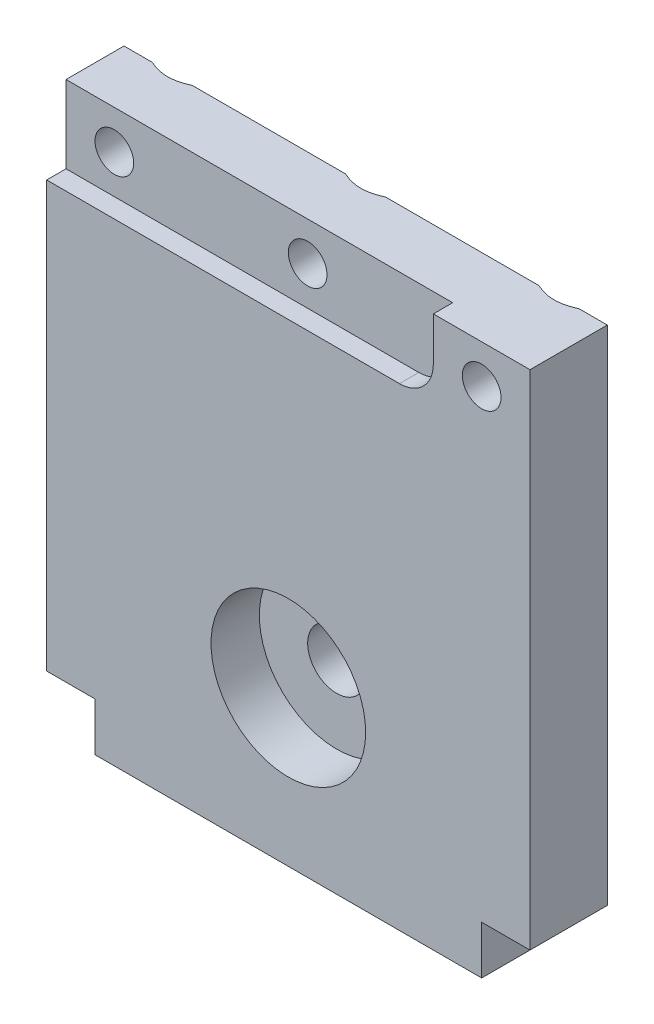
ISO-10303-21;
HEADER;
FILE_DESCRIPTION(('STEP AP214'),'2;1');
FILE_NAME('part.step','',(''),(''),'','','');
FILE_SCHEMA(('AUTOMOTIVE_DESIGN { 1 0 10303 214 1 1 1 1 }'));
ENDSEC;
DATA;
#1=APPLICATION_CONTEXT('core data for automotive mechanical design processes');
#2=APPLICATION_PROTOCOL_DEFINITION('international standard','automotive_design',2000,#1);
#3=PRODUCT_CONTEXT('',#1,'mechanical');
#4=PRODUCT('Part','Part','',(#3));
#5=PRODUCT_RELATED_PRODUCT_CATEGORY('part','',(#4));
#6=PRODUCT_DEFINITION_FORMATION('','',#4);
#7=PRODUCT_DEFINITION_CONTEXT('part definition',#1,'design');
#8=PRODUCT_DEFINITION('design','',#6,#7);
#9=PRODUCT_DEFINITION_SHAPE('','',#8);
#10=(LENGTH_UNIT() NAMED_UNIT(*) SI_UNIT(.MILLI.,.METRE.));
#11=(NAMED_UNIT(*) PLANE_ANGLE_UNIT() SI_UNIT($,.RADIAN.));
#12=(NAMED_UNIT(*) SI_UNIT($,.STERADIAN.) SOLID_ANGLE_UNIT());
#13=UNCERTAINTY_MEASURE_WITH_UNIT(LENGTH_MEASURE(1.E-05),#10,'distance_accuracy_value','');
#14=(GEOMETRIC_REPRESENTATION_CONTEXT(3) GLOBAL_UNCERTAINTY_ASSIGNED_CONTEXT((#13)) GLOBAL_UNIT_ASSIGNED_CONTEXT((#10,
#11,#12)) REPRESENTATION_CONTEXT('',''));
#15=CARTESIAN_POINT('',(0.,0.,0.));
#16=DIRECTION('',(0.,0.,1.));
#17=DIRECTION('',(1.,0.,0.));
#18=AXIS2_PLACEMENT_3D('',#15,#16,#17);
#19=CARTESIAN_POINT('',(-20.,24.5,0.));
#20=DIRECTION('',(0.,0.,1.));
#21=DIRECTION('',(1.,0.,0.));
#22=AXIS2_PLACEMENT_3D('',#19,#20,#21);
#23=CYLINDRICAL_SURFACE('',#22,2.);
#24=CARTESIAN_POINT('',(-20.,24.5,2.50000000000002));
#25=DIRECTION('',(0.,0.,1.));
#26=DIRECTION('',(1.,0.,0.));
#27=AXIS2_PLACEMENT_3D('',#24,#25,#26);
#28=CIRCLE('',#27,2.);
#29=CARTESIAN_POINT('',(-18.,24.5,2.50000000000002));
#30=VERTEX_POINT('',#29);
#31=EDGE_CURVE('E364',#30,#30,#28,.F.);
#32=ORIENTED_EDGE('',*,*,#31,.T.);
#33=EDGE_LOOP('',(#32));
#34=FACE_BOUND('',#33,.T.);
#35=CARTESIAN_POINT('',(-20.,24.5,6.));
#36=DIRECTION('',(0.,0.,1.));
#37=DIRECTION('',(1.,0.,0.));
#38=AXIS2_PLACEMENT_3D('',#35,#36,#37);
#39=CIRCLE('',#38,2.);
#40=CARTESIAN_POINT('',(-18.,24.5,6.));
#41=VERTEX_POINT('',#40);
#42=EDGE_CURVE('E169',#41,#41,#39,.F.);
#43=ORIENTED_EDGE('',*,*,#42,.F.);
#44=EDGE_LOOP('',(#43));
#45=FACE_BOUND('',#44,.T.);
#46=ADVANCED_FACE('F35',(#34,#45),#23,.F.);
#47=CARTESIAN_POINT('',(0.,24.5,0.));
#48=DIRECTION('',(0.,0.,1.));
#49=DIRECTION('',(1.,0.,0.));
#50=AXIS2_PLACEMENT_3D('',#47,#48,#49);
#51=CYLINDRICAL_SURFACE('',#50,2.);
#52=CARTESIAN_POINT('',(0.,24.5,2.50000000000001));
#53=DIRECTION('',(0.,0.,1.));
#54=DIRECTION('',(1.,0.,0.));
#55=AXIS2_PLACEMENT_3D('',#52,#53,#54);
#56=CIRCLE('',#55,2.);
#57=CARTESIAN_POINT('',(2.,24.5,2.50000000000001));
#58=VERTEX_POINT('',#57);
#59=EDGE_CURVE('E300',#58,#58,#56,.F.);
#60=ORIENTED_EDGE('',*,*,#59,.T.);
#61=EDGE_LOOP('',(#60));
#62=FACE_BOUND('',#61,.T.);
#63=CARTESIAN_POINT('',(0.,24.5,6.));
#64=DIRECTION('',(0.,0.,1.));
#65=DIRECTION('',(1.,0.,0.));
#66=AXIS2_PLACEMENT_3D('',#63,#64,#65);
#67=CIRCLE('',#66,2.);
#68=CARTESIAN_POINT('',(2.,24.5,6.));
#69=VERTEX_POINT('',#68);
#70=EDGE_CURVE('E164',#69,#69,#67,.F.);
#71=ORIENTED_EDGE('',*,*,#70,.F.);
#72=EDGE_LOOP('',(#71));
#73=FACE_BOUND('',#72,.T.);
#74=ADVANCED_FACE('F321',(#62,#73),#51,.F.);
#75=CARTESIAN_POINT('',(-25.,28.5,8.));
#76=DIRECTION('',(1.,0.,0.));
#77=DIRECTION('',(0.,1.,0.));
#78=AXIS2_PLACEMENT_3D('',#75,#76,#77);
#79=PLANE('',#78);
#80=DIRECTION('',(0.,-1.,0.));
#81=VECTOR('',#80,1.);
#82=CARTESIAN_POINT('',(-25.,28.5,8.));
#83=LINE('',#82,#81);
#84=CARTESIAN_POINT('',(-25.,20.5,8.));
#85=VERTEX_POINT('',#84);
#86=CARTESIAN_POINT('',(-25.,-23.5,8.));
#87=VERTEX_POINT('',#86);
#88=EDGE_CURVE('E160',#85,#87,#83,.T.);
#89=ORIENTED_EDGE('',*,*,#88,.F.);
#90=DIRECTION('',(0.,0.,1.));
#91=VECTOR('',#90,1.);
#92=CARTESIAN_POINT('',(-25.,20.5,6.));
#93=LINE('',#92,#91);
#94=CARTESIAN_POINT('',(-25.,20.5,6.));
#95=VERTEX_POINT('',#94);
#96=EDGE_CURVE('E142',#95,#85,#93,.T.);
#97=ORIENTED_EDGE('',*,*,#96,.F.);
#98=DIRECTION('',(0.,-1.,0.));
#99=VECTOR('',#98,1.);
#100=CARTESIAN_POINT('',(-25.,28.5,6.));
#101=LINE('',#100,#99);
#102=CARTESIAN_POINT('',(-25.,28.5,6.));
#103=VERTEX_POINT('',#102);
#104=EDGE_CURVE('E146',#103,#95,#101,.T.);
#105=ORIENTED_EDGE('',*,*,#104,.F.);
#106=DIRECTION('',(0.,0.,-1.));
#107=VECTOR('',#106,1.);
#108=CARTESIAN_POINT('',(-25.,28.5,8.));
#109=LINE('',#108,#107);
#110=CARTESIAN_POINT('',(-25.,28.5,0.));
#111=VERTEX_POINT('',#110);
#112=EDGE_CURVE('E217',#103,#111,#109,.T.);
#113=ORIENTED_EDGE('',*,*,#112,.T.);
#114=DIRECTION('',(0.,-1.,0.));
#115=VECTOR('',#114,1.);
#116=CARTESIAN_POINT('',(-25.,28.5,0.));
#117=LINE('',#116,#115);
#118=CARTESIAN_POINT('',(-25.,-23.5,0.));
#119=VERTEX_POINT('',#118);
#120=EDGE_CURVE('E197',#111,#119,#117,.T.);
#121=ORIENTED_EDGE('',*,*,#120,.T.);
#122=DIRECTION('',(0.,0.,-1.));
#123=VECTOR('',#122,1.);
#124=CARTESIAN_POINT('',(-25.,-23.5,8.));
#125=LINE('',#124,#123);
#126=EDGE_CURVE('E255',#87,#119,#125,.T.);
#127=ORIENTED_EDGE('',*,*,#126,.F.);
#128=EDGE_LOOP('',(#89,#97,#105,#113,#121,#127));
#129=FACE_BOUND('',#128,.T.);
#130=ADVANCED_FACE('F158',(#129),#79,.F.);
#131=CARTESIAN_POINT('',(-25.,-23.5,8.));
#132=DIRECTION('',(0.,1.,0.));
#133=DIRECTION('',(-1.,0.,0.));
#134=AXIS2_PLACEMENT_3D('',#131,#132,#133);
#135=PLANE('',#134);
#136=DIRECTION('',(1.,0.,0.));
#137=VECTOR('',#136,1.);
#138=CARTESIAN_POINT('',(-25.,-23.5,0.));
#139=LINE('',#138,#137);
#140=CARTESIAN_POINT('',(-20.,-23.5,0.));
#141=VERTEX_POINT('',#140);
#142=EDGE_CURVE('E220',#119,#141,#139,.T.);
#143=ORIENTED_EDGE('',*,*,#142,.T.);
#144=DIRECTION('',(0.,0.,-1.));
#145=VECTOR('',#144,1.);
#146=CARTESIAN_POINT('',(-20.,-23.5,8.));
#147=LINE('',#146,#145);
#148=CARTESIAN_POINT('',(-20.,-23.5,8.));
#149=VERTEX_POINT('',#148);
#150=EDGE_CURVE('E252',#149,#141,#147,.T.);
#151=ORIENTED_EDGE('',*,*,#150,.F.);
#152=DIRECTION('',(1.,0.,0.));
#153=VECTOR('',#152,1.);
#154=CARTESIAN_POINT('',(-25.,-23.5,8.));
#155=LINE('',#154,#153);
#156=EDGE_CURVE('E201',#87,#149,#155,.T.);
#157=ORIENTED_EDGE('',*,*,#156,.F.);
#158=ORIENTED_EDGE('',*,*,#126,.T.);
#159=EDGE_LOOP('',(#143,#151,#157,#158));
#160=FACE_BOUND('',#159,.T.);
#161=ADVANCED_FACE('F546',(#160),#135,.F.);
#162=CARTESIAN_POINT('',(-20.,-23.5,8.));
#163=DIRECTION('',(1.,0.,0.));
#164=DIRECTION('',(0.,0.,-1.));
#165=AXIS2_PLACEMENT_3D('',#162,#163,#164);
#166=PLANE('',#165);
#167=DIRECTION('',(0.,-1.,0.));
#168=VECTOR('',#167,1.);
#169=CARTESIAN_POINT('',(-20.,-23.5,0.));
#170=LINE('',#169,#168);
#171=CARTESIAN_POINT('',(-20.,-28.5,0.));
#172=VERTEX_POINT('',#171);
#173=EDGE_CURVE('E222',#141,#172,#170,.T.);
#174=ORIENTED_EDGE('',*,*,#173,.T.);
#175=DIRECTION('',(0.,0.,-1.));
#176=VECTOR('',#175,1.);
#177=CARTESIAN_POINT('',(-20.,-28.5,8.));
#178=LINE('',#177,#176);
#179=CARTESIAN_POINT('',(-20.,-28.5,8.));
#180=VERTEX_POINT('',#179);
#181=EDGE_CURVE('E249',#180,#172,#178,.T.);
#182=ORIENTED_EDGE('',*,*,#181,.F.);
#183=DIRECTION('',(0.,-1.,0.));
#184=VECTOR('',#183,1.);
#185=CARTESIAN_POINT('',(-20.,-23.5,8.));
#186=LINE('',#185,#184);
#187=EDGE_CURVE('E204',#149,#180,#186,.T.);
#188=ORIENTED_EDGE('',*,*,#187,.F.);
#189=ORIENTED_EDGE('',*,*,#150,.T.);
#190=EDGE_LOOP('',(#174,#182,#188,#189));
#191=FACE_BOUND('',#190,.T.);
#192=ADVANCED_FACE('F538',(#191),#166,.F.);
#193=CARTESIAN_POINT('',(-20.,-28.5,8.));
#194=DIRECTION('',(0.,1.,0.));
#195=DIRECTION('',(0.,0.,1.));
#196=AXIS2_PLACEMENT_3D('',#193,#194,#195);
#197=PLANE('',#196);
#198=CARTESIAN_POINT('',(15.,-28.5,4.));
#199=DIRECTION('',(0.,-1.,0.));
#200=DIRECTION('',(0.,0.,-1.));
#201=AXIS2_PLACEMENT_3D('',#198,#199,#200);
#202=CIRCLE('',#201,2.);
#203=CARTESIAN_POINT('',(15.,-28.5,2.));
#204=VERTEX_POINT('',#203);
#205=EDGE_CURVE('E187',#204,#204,#202,.T.);
#206=ORIENTED_EDGE('',*,*,#205,.F.);
#207=EDGE_LOOP('',(#206));
#208=FACE_BOUND('',#207,.T.);
#209=CARTESIAN_POINT('',(-15.,-28.5,4.));
#210=DIRECTION('',(0.,-1.,0.));
#211=DIRECTION('',(0.,0.,-1.));
#212=AXIS2_PLACEMENT_3D('',#209,#210,#211);
#213=CIRCLE('',#212,2.);
#214=CARTESIAN_POINT('',(-15.,-28.5,2.));
#215=VERTEX_POINT('',#214);
#216=EDGE_CURVE('E191',#215,#215,#213,.T.);
#217=ORIENTED_EDGE('',*,*,#216,.F.);
#218=EDGE_LOOP('',(#217));
#219=FACE_BOUND('',#218,.T.);
#220=DIRECTION('',(1.,0.,0.));
#221=VECTOR('',#220,1.);
#222=CARTESIAN_POINT('',(-20.,-28.5,0.));
#223=LINE('',#222,#221);
#224=CARTESIAN_POINT('',(20.,-28.5,0.));
#225=VERTEX_POINT('',#224);
#226=EDGE_CURVE('E224',#172,#225,#223,.T.);
#227=ORIENTED_EDGE('',*,*,#226,.T.);
#228=DIRECTION('',(0.,0.,-1.));
#229=VECTOR('',#228,1.);
#230=CARTESIAN_POINT('',(20.,-28.5,8.));
#231=LINE('',#230,#229);
#232=CARTESIAN_POINT('',(20.,-28.5,8.));
#233=VERTEX_POINT('',#232);
#234=EDGE_CURVE('E246',#233,#225,#231,.T.);
#235=ORIENTED_EDGE('',*,*,#234,.F.);
#236=DIRECTION('',(1.,0.,0.));
#237=VECTOR('',#236,1.);
#238=CARTESIAN_POINT('',(-20.,-28.5,8.));
#239=LINE('',#238,#237);
#240=EDGE_CURVE('E206',#180,#233,#239,.T.);
#241=ORIENTED_EDGE('',*,*,#240,.F.);
#242=ORIENTED_EDGE('',*,*,#181,.T.);
#243=EDGE_LOOP('',(#227,#235,#241,#242));
#244=FACE_BOUND('',#243,.T.);
#245=ADVANCED_FACE('F529',(#208,#219,#244),#197,.F.);
#246=CARTESIAN_POINT('',(20.,-23.5,8.));
#247=DIRECTION('',(-1.,0.,0.));
#248=DIRECTION('',(0.,0.,1.));
#249=AXIS2_PLACEMENT_3D('',#246,#247,#248);
#250=PLANE('',#249);
#251=DIRECTION('',(0.,1.,0.));
#252=VECTOR('',#251,1.);
#253=CARTESIAN_POINT('',(20.,-23.5,0.));
#254=LINE('',#253,#252);
#255=CARTESIAN_POINT('',(20.,-23.5,0.));
#256=VERTEX_POINT('',#255);
#257=EDGE_CURVE('E226',#225,#256,#254,.T.);
#258=ORIENTED_EDGE('',*,*,#257,.T.);
#259=DIRECTION('',(0.,0.,-1.));
#260=VECTOR('',#259,1.);
#261=CARTESIAN_POINT('',(20.,-23.5,8.));
#262=LINE('',#261,#260);
#263=CARTESIAN_POINT('',(20.,-23.5,8.));
#264=VERTEX_POINT('',#263);
#265=EDGE_CURVE('E243',#264,#256,#262,.T.);
#266=ORIENTED_EDGE('',*,*,#265,.F.);
#267=DIRECTION('',(0.,1.,0.));
#268=VECTOR('',#267,1.);
#269=CARTESIAN_POINT('',(20.,-23.5,8.));
#270=LINE('',#269,#268);
#271=EDGE_CURVE('E208',#233,#264,#270,.T.);
#272=ORIENTED_EDGE('',*,*,#271,.F.);
#273=ORIENTED_EDGE('',*,*,#234,.T.);
#274=EDGE_LOOP('',(#258,#266,#272,#273));
#275=FACE_BOUND('',#274,.T.);
#276=ADVANCED_FACE('F521',(#275),#250,.F.);
#277=CARTESIAN_POINT('',(25.,-23.5,8.));
#278=DIRECTION('',(0.,1.,0.));
#279=DIRECTION('',(0.,0.,1.));
#280=AXIS2_PLACEMENT_3D('',#277,#278,#279);
#281=PLANE('',#280);
#282=DIRECTION('',(1.,0.,0.));
#283=VECTOR('',#282,1.);
#284=CARTESIAN_POINT('',(25.,-23.5,0.));
#285=LINE('',#284,#283);
#286=CARTESIAN_POINT('',(25.,-23.5,0.));
#287=VERTEX_POINT('',#286);
#288=EDGE_CURVE('E228',#256,#287,#285,.T.);
#289=ORIENTED_EDGE('',*,*,#288,.T.);
#290=DIRECTION('',(0.,0.,-1.));
#291=VECTOR('',#290,1.);
#292=CARTESIAN_POINT('',(25.,-23.5,8.));
#293=LINE('',#292,#291);
#294=CARTESIAN_POINT('',(25.,-23.5,8.));
#295=VERTEX_POINT('',#294);
#296=EDGE_CURVE('E240',#295,#287,#293,.T.);
#297=ORIENTED_EDGE('',*,*,#296,.F.);
#298=DIRECTION('',(1.,0.,0.));
#299=VECTOR('',#298,1.);
#300=CARTESIAN_POINT('',(25.,-23.5,8.));
#301=LINE('',#300,#299);
#302=EDGE_CURVE('E210',#264,#295,#301,.T.);
#303=ORIENTED_EDGE('',*,*,#302,.F.);
#304=ORIENTED_EDGE('',*,*,#265,.T.);
#305=EDGE_LOOP('',(#289,#297,#303,#304));
#306=FACE_BOUND('',#305,.T.);
#307=ADVANCED_FACE('F513',(#306),#281,.F.);
#308=CARTESIAN_POINT('',(25.,28.5,8.));
#309=DIRECTION('',(-1.,0.,0.));
#310=DIRECTION('',(0.,0.,1.));
#311=AXIS2_PLACEMENT_3D('',#308,#309,#310);
#312=PLANE('',#311);
#313=DIRECTION('',(0.,1.,0.));
#314=VECTOR('',#313,1.);
#315=CARTESIAN_POINT('',(25.,28.5,0.));
#316=LINE('',#315,#314);
#317=CARTESIAN_POINT('',(25.,28.5,0.));
#318=VERTEX_POINT('',#317);
#319=EDGE_CURVE('E230',#287,#318,#316,.T.);
#320=ORIENTED_EDGE('',*,*,#319,.T.);
#321=DIRECTION('',(0.,0.,-1.));
#322=VECTOR('',#321,1.);
#323=CARTESIAN_POINT('',(25.,28.5,8.));
#324=LINE('',#323,#322);
#325=CARTESIAN_POINT('',(25.,28.5,8.));
#326=VERTEX_POINT('',#325);
#327=EDGE_CURVE('E237',#326,#318,#324,.T.);
#328=ORIENTED_EDGE('',*,*,#327,.F.);
#329=DIRECTION('',(0.,1.,0.));
#330=VECTOR('',#329,1.);
#331=CARTESIAN_POINT('',(25.,28.5,8.));
#332=LINE('',#331,#330);
#333=EDGE_CURVE('E212',#295,#326,#332,.T.);
#334=ORIENTED_EDGE('',*,*,#333,.F.);
#335=ORIENTED_EDGE('',*,*,#296,.T.);
#336=EDGE_LOOP('',(#320,#328,#334,#335));
#337=FACE_BOUND('',#336,.T.);
#338=ADVANCED_FACE('F287',(#337),#312,.F.);
#339=CARTESIAN_POINT('',(-25.,28.5,8.));
#340=DIRECTION('',(0.,-1.,0.));
#341=DIRECTION('',(1.,0.,0.));
#342=AXIS2_PLACEMENT_3D('',#339,#340,#341);
#343=PLANE('',#342);
#344=DIRECTION('',(-1.,0.,0.));
#345=VECTOR('',#344,1.);
#346=CARTESIAN_POINT('',(-25.,28.5,6.));
#347=LINE('',#346,#345);
#348=CARTESIAN_POINT('',(15.,28.5,6.));
#349=VERTEX_POINT('',#348);
#350=EDGE_CURVE('E152',#349,#103,#347,.T.);
#351=ORIENTED_EDGE('',*,*,#350,.F.);
#352=DIRECTION('',(0.,0.,1.));
#353=VECTOR('',#352,1.);
#354=CARTESIAN_POINT('',(15.,28.5,6.));
#355=LINE('',#354,#353);
#356=CARTESIAN_POINT('',(15.,28.5,8.));
#357=VERTEX_POINT('',#356);
#358=EDGE_CURVE('E161',#349,#357,#355,.T.);
#359=ORIENTED_EDGE('',*,*,#358,.T.);
#360=DIRECTION('',(-1.,0.,0.));
#361=VECTOR('',#360,1.);
#362=CARTESIAN_POINT('',(-25.,28.5,8.));
#363=LINE('',#362,#361);
#364=EDGE_CURVE('E214',#326,#357,#363,.T.);
#365=ORIENTED_EDGE('',*,*,#364,.F.);
#366=ORIENTED_EDGE('',*,*,#327,.T.);
#367=DIRECTION('',(-1.,0.,0.));
#368=VECTOR('',#367,1.);
#369=CARTESIAN_POINT('',(-25.,28.5,0.));
#370=LINE('',#369,#368);
#371=CARTESIAN_POINT('',(22.0615528128088,28.5,0.));
#372=VERTEX_POINT('',#371);
#373=EDGE_CURVE('E202',#318,#372,#370,.T.);
#374=ORIENTED_EDGE('',*,*,#373,.T.);
#375=CARTESIAN_POINT('',(22.0615528128088,28.5,0.));
#376=CARTESIAN_POINT('',(21.9163115076665,28.5,0.0665140046887301));
#377=CARTESIAN_POINT('',(21.7687872339746,28.5,0.128569718966713));
#378=CARTESIAN_POINT('',(21.4687365346781,28.5,0.241160332854404));
#379=CARTESIAN_POINT('',(21.3161917571449,28.5,0.291645925575715));
#380=CARTESIAN_POINT('',(21.0088769190301,28.5,0.377331377129475));
#381=CARTESIAN_POINT('',(20.8541609144906,28.5,0.412719940976492));
#382=CARTESIAN_POINT('',(20.5419867211631,28.5,0.466367057856301));
#383=CARTESIAN_POINT('',(20.3845337208675,28.5,0.484655043680468));
#384=CARTESIAN_POINT('',(20.0809432550529,28.5,0.501824046995297));
#385=CARTESIAN_POINT('',(19.9348859756068,28.5,0.502113580668128));
#386=CARTESIAN_POINT('',(19.6435468990572,28.5,0.486786692782426));
#387=CARTESIAN_POINT('',(19.4982655528719,28.5,0.471161860054131));
#388=CARTESIAN_POINT('',(19.2100936986599,28.5,0.425237963374039));
#389=CARTESIAN_POINT('',(19.067203240881,28.5,0.394938591416323));
#390=CARTESIAN_POINT('',(18.7846957776989,28.5,0.321684210682046));
#391=CARTESIAN_POINT('',(18.6450801209539,28.5,0.278724083308546));
#392=CARTESIAN_POINT('',(18.410526573718,28.5,0.196723660111647));
#393=CARTESIAN_POINT('',(18.3146468065157,28.5,0.16031545116514));
#394=CARTESIAN_POINT('',(18.1250409435993,28.5,0.0832113414498181));
#395=CARTESIAN_POINT('',(18.0313081138786,28.5,0.042532050748546));
#396=CARTESIAN_POINT('',(17.9384471871911,28.5,0.));
#397=B_SPLINE_CURVE_WITH_KNOTS('',3,(#375,#376,#377,#378,#379,#380,#381,#382,#383,#384,#385,
#386,#387,#388,#389,#390,#391,#392,#393,#394,#395,#396),.UNSPECIFIED.,.F.,.F.,(4,2,2,2,2,2,2,2,
2,2,4),(0.,0.479497727555005,0.961002368999467,1.43629834305226,1.91077474381833,
2.34806888838962,2.78559427464543,3.2231288445797,3.66084054790949,3.968414012628,
4.27483277985521),.UNSPECIFIED.);
#398=CARTESIAN_POINT('',(17.9384471871912,28.5,0.));
#399=VERTEX_POINT('',#398);
#400=EDGE_CURVE('E273',#372,#399,#397,.T.);
#401=ORIENTED_EDGE('',*,*,#400,.T.);
#402=CARTESIAN_POINT('',(2.06155281280885,28.5,0.));
#403=VERTEX_POINT('',#402);
#404=EDGE_CURVE('E235',#399,#403,#370,.T.);
#405=ORIENTED_EDGE('',*,*,#404,.T.);
#406=CARTESIAN_POINT('',(2.06155281280885,28.5,0.));
#407=CARTESIAN_POINT('',(1.91631150766653,28.5,0.0665140046887301));
#408=CARTESIAN_POINT('',(1.7687872339746,28.5,0.128569718966714));
#409=CARTESIAN_POINT('',(1.46873653467814,28.5,0.241160332854406));
#410=CARTESIAN_POINT('',(1.31619175714491,28.5,0.291645925575718));
#411=CARTESIAN_POINT('',(1.00887691903006,28.5,0.377331377129478));
#412=CARTESIAN_POINT('',(0.85416091449057,28.5,0.412719940976494));
#413=CARTESIAN_POINT('',(0.541986721163106,28.5,0.466367057856304));
#414=CARTESIAN_POINT('',(0.38453372086754,28.5,0.484655043680471));
#415=CARTESIAN_POINT('',(0.0809432550529437,28.5,0.501824046995299));
#416=CARTESIAN_POINT('',(-0.0651140243932302,28.5,0.50211358066813));
#417=CARTESIAN_POINT('',(-0.356453100942829,28.5,0.486786692782427));
#418=CARTESIAN_POINT('',(-0.501734447128126,28.5,0.471161860054132));
#419=CARTESIAN_POINT('',(-0.789906301340141,28.5,0.425237963374039));
#420=CARTESIAN_POINT('',(-0.932796759119046,28.5,0.394938591416322));
#421=CARTESIAN_POINT('',(-1.21530422230115,28.5,0.321684210682045));
#422=CARTESIAN_POINT('',(-1.35491987904607,28.5,0.278724083308545));
#423=CARTESIAN_POINT('',(-1.58947342628203,28.5,0.196723660111647));
#424=CARTESIAN_POINT('',(-1.68535319348432,28.5,0.160315451165141));
#425=CARTESIAN_POINT('',(-1.87495905640074,28.5,0.0832113414498207));
#426=CARTESIAN_POINT('',(-1.96869188612143,28.5,0.0425320507485486));
#427=CARTESIAN_POINT('',(-2.06155281280885,28.5,0.));
#428=B_SPLINE_CURVE_WITH_KNOTS('',3,(#406,#407,#408,#409,#410,#411,#412,#413,#414,#415,#416,
#417,#418,#419,#420,#421,#422,#423,#424,#425,#426,#427),.UNSPECIFIED.,.F.,.F.,(4,2,2,2,2,2,2,2,
2,2,4),(0.,0.479497727555007,0.961002368999472,1.43629834305227,1.91077474381835,
2.34806888838963,2.78559427464544,3.22312884457971,3.66084054790951,3.96841401262801,
4.27483277985521),.UNSPECIFIED.);
#429=CARTESIAN_POINT('',(-2.06155281280885,28.5,0.));
#430=VERTEX_POINT('',#429);
#431=EDGE_CURVE('E294',#403,#430,#428,.T.);
#432=ORIENTED_EDGE('',*,*,#431,.T.);
#433=CARTESIAN_POINT('',(-17.9384471871911,28.5,0.));
#434=VERTEX_POINT('',#433);
#435=EDGE_CURVE('E592',#430,#434,#370,.T.);
#436=ORIENTED_EDGE('',*,*,#435,.T.);
#437=CARTESIAN_POINT('',(-17.9384471871911,28.5,0.));
#438=CARTESIAN_POINT('',(-18.0836884923335,28.5,0.0665140046887315));
#439=CARTESIAN_POINT('',(-18.2312127660254,28.5,0.128569718966716));
#440=CARTESIAN_POINT('',(-18.5312634653218,28.5,0.241160332854409));
#441=CARTESIAN_POINT('',(-18.6838082428551,28.5,0.291645925575721));
#442=CARTESIAN_POINT('',(-18.9911230809699,28.5,0.377331377129481));
#443=CARTESIAN_POINT('',(-19.1458390855094,28.5,0.412719940976498));
#444=CARTESIAN_POINT('',(-19.4580132788369,28.5,0.46636705785631));
#445=CARTESIAN_POINT('',(-19.6154662791325,28.5,0.484655043680477));
#446=CARTESIAN_POINT('',(-19.919056744947,28.5,0.501824046995306));
#447=CARTESIAN_POINT('',(-20.0651140243932,28.5,0.502113580668137));
#448=CARTESIAN_POINT('',(-20.3564531009428,28.5,0.486786692782435));
#449=CARTESIAN_POINT('',(-20.5017344471281,28.5,0.47116186005414));
#450=CARTESIAN_POINT('',(-20.7899063013401,28.5,0.425237963374048));
#451=CARTESIAN_POINT('',(-20.932796759119,28.5,0.394938591416331));
#452=CARTESIAN_POINT('',(-21.2153042223011,28.5,0.321684210682054));
#453=CARTESIAN_POINT('',(-21.3549198790461,28.5,0.278724083308555));
#454=CARTESIAN_POINT('',(-21.589473426282,28.5,0.196723660111654));
#455=CARTESIAN_POINT('',(-21.6853531934843,28.5,0.160315451165146));
#456=CARTESIAN_POINT('',(-21.8749590564008,28.5,0.0832113414498218));
#457=CARTESIAN_POINT('',(-21.9686918861214,28.5,0.0425320507485483));
#458=CARTESIAN_POINT('',(-22.0615528128089,28.5,0.));
#459=B_SPLINE_CURVE_WITH_KNOTS('',3,(#437,#438,#439,#440,#441,#442,#443,#444,#445,#446,#447,
#448,#449,#450,#451,#452,#453,#454,#455,#456,#457,#458),.UNSPECIFIED.,.F.,.F.,(4,2,2,2,2,2,2,2,
2,2,4),(0.,0.479497727555006,0.961002368999476,1.43629834305227,1.91077474381835,
2.34806888838963,2.78559427464545,3.22312884457971,3.66084054790951,3.96841401262803,
4.27483277985524),.UNSPECIFIED.);
#460=CARTESIAN_POINT('',(-22.0615528128089,28.5,0.));
#461=VERTEX_POINT('',#460);
#462=EDGE_CURVE('E267',#434,#461,#459,.T.);
#463=ORIENTED_EDGE('',*,*,#462,.T.);
#464=EDGE_CURVE('E232',#461,#111,#370,.T.);
#465=ORIENTED_EDGE('',*,*,#464,.T.);
#466=ORIENTED_EDGE('',*,*,#112,.F.);
#467=EDGE_LOOP('',(#351,#359,#365,#366,#374,#401,#405,#432,#436,#463,#465,#466));
#468=FACE_BOUND('',#467,.T.);
#469=ADVANCED_FACE('F281',(#468),#343,.F.);
#470=CARTESIAN_POINT('',(0.,0.,8.));
#471=DIRECTION('',(0.,0.,1.));
#472=DIRECTION('',(1.,0.,0.));
#473=AXIS2_PLACEMENT_3D('',#470,#471,#472);
#474=PLANE('',#473);
#475=DIRECTION('',(0.,1.,0.));
#476=VECTOR('',#475,1.);
#477=CARTESIAN_POINT('',(15.,20.5,8.));
#478=LINE('',#477,#476);
#479=CARTESIAN_POINT('',(15.,24.,8.));
#480=VERTEX_POINT('',#479);
#481=EDGE_CURVE('E155',#480,#357,#478,.T.);
#482=ORIENTED_EDGE('',*,*,#481,.F.);
#483=CARTESIAN_POINT('',(11.5,24.,8.));
#484=DIRECTION('',(0.,0.,1.));
#485=DIRECTION('',(1.,0.,0.));
#486=AXIS2_PLACEMENT_3D('',#483,#484,#485);
#487=CIRCLE('',#486,3.5);
#488=CARTESIAN_POINT('',(11.5,20.5,8.));
#489=VERTEX_POINT('',#488);
#490=EDGE_CURVE('E12',#480,#489,#487,.F.);
#491=ORIENTED_EDGE('',*,*,#490,.T.);
#492=DIRECTION('',(1.,0.,0.));
#493=VECTOR('',#492,1.);
#494=CARTESIAN_POINT('',(-25.,20.5,8.));
#495=LINE('',#494,#493);
#496=EDGE_CURVE('E604',#85,#489,#495,.T.);
#497=ORIENTED_EDGE('',*,*,#496,.F.);
#498=ORIENTED_EDGE('',*,*,#88,.T.);
#499=ORIENTED_EDGE('',*,*,#156,.T.);
#500=ORIENTED_EDGE('',*,*,#187,.T.);
#501=ORIENTED_EDGE('',*,*,#240,.T.);
#502=ORIENTED_EDGE('',*,*,#271,.T.);
#503=ORIENTED_EDGE('',*,*,#302,.T.);
#504=ORIENTED_EDGE('',*,*,#333,.T.);
#505=ORIENTED_EDGE('',*,*,#364,.T.);
#506=EDGE_LOOP('',(#482,#491,#497,#498,#499,#500,#501,#502,#503,#504,#505));
#507=FACE_BOUND('',#506,.T.);
#508=CARTESIAN_POINT('',(0.,-12.5,8.));
#509=DIRECTION('',(0.,0.,1.));
#510=DIRECTION('',(1.,0.,0.));
#511=AXIS2_PLACEMENT_3D('',#508,#509,#510);
#512=CIRCLE('',#511,8.);
#513=CARTESIAN_POINT('',(8.,-12.5,8.));
#514=VERTEX_POINT('',#513);
#515=EDGE_CURVE('E178',#514,#514,#512,.T.);
#516=ORIENTED_EDGE('',*,*,#515,.F.);
#517=EDGE_LOOP('',(#516));
#518=FACE_BOUND('',#517,.T.);
#519=CARTESIAN_POINT('',(20.,24.5,8.));
#520=DIRECTION('',(0.,0.,1.));
#521=DIRECTION('',(1.,0.,0.));
#522=AXIS2_PLACEMENT_3D('',#519,#520,#521);
#523=CIRCLE('',#522,2.00000000000001);
#524=CARTESIAN_POINT('',(22.,24.5,8.));
#525=VERTEX_POINT('',#524);
#526=EDGE_CURVE('E182',#525,#525,#523,.T.);
#527=ORIENTED_EDGE('',*,*,#526,.F.);
#528=EDGE_LOOP('',(#527));
#529=FACE_BOUND('',#528,.T.);
#530=ADVANCED_FACE('F286',(#507,#518,#529),#474,.T.);
#531=CARTESIAN_POINT('',(0.,0.,0.));
#532=DIRECTION('',(0.,0.,1.));
#533=DIRECTION('',(1.,0.,0.));
#534=AXIS2_PLACEMENT_3D('',#531,#532,#533);
#535=PLANE('',#534);
#536=CARTESIAN_POINT('',(0.,-12.5,0.));
#537=DIRECTION('',(0.,0.,1.));
#538=DIRECTION('',(1.,0.,0.));
#539=AXIS2_PLACEMENT_3D('',#536,#537,#538);
#540=CIRCLE('',#539,3.);
#541=CARTESIAN_POINT('',(3.,-12.5,0.));
#542=VERTEX_POINT('',#541);
#543=EDGE_CURVE('E175',#542,#542,#540,.T.);
#544=ORIENTED_EDGE('',*,*,#543,.T.);
#545=EDGE_LOOP('',(#544));
#546=FACE_BOUND('',#545,.T.);
#547=ORIENTED_EDGE('',*,*,#435,.F.);
#548=CARTESIAN_POINT('',(0.,24.5,0.));
#549=DIRECTION('',(0.,0.,1.));
#550=DIRECTION('',(1.,0.,0.));
#551=AXIS2_PLACEMENT_3D('',#548,#549,#550);
#552=CIRCLE('',#551,4.5);
#553=EDGE_CURVE('E264',#430,#403,#552,.T.);
#554=ORIENTED_EDGE('',*,*,#553,.T.);
#555=ORIENTED_EDGE('',*,*,#404,.F.);
#556=CARTESIAN_POINT('',(20.,24.5,0.));
#557=DIRECTION('',(0.,0.,1.));
#558=DIRECTION('',(1.,0.,0.));
#559=AXIS2_PLACEMENT_3D('',#556,#557,#558);
#560=CIRCLE('',#559,4.50000000000001);
#561=EDGE_CURVE('E261',#399,#372,#560,.T.);
#562=ORIENTED_EDGE('',*,*,#561,.T.);
#563=ORIENTED_EDGE('',*,*,#373,.F.);
#564=ORIENTED_EDGE('',*,*,#319,.F.);
#565=ORIENTED_EDGE('',*,*,#288,.F.);
#566=ORIENTED_EDGE('',*,*,#257,.F.);
#567=ORIENTED_EDGE('',*,*,#226,.F.);
#568=ORIENTED_EDGE('',*,*,#173,.F.);
#569=ORIENTED_EDGE('',*,*,#142,.F.);
#570=ORIENTED_EDGE('',*,*,#120,.F.);
#571=ORIENTED_EDGE('',*,*,#464,.F.);
#572=CARTESIAN_POINT('',(-20.,24.5,0.));
#573=DIRECTION('',(0.,0.,1.));
#574=DIRECTION('',(1.,0.,0.));
#575=AXIS2_PLACEMENT_3D('',#572,#573,#574);
#576=CIRCLE('',#575,4.5);
#577=EDGE_CURVE('E258',#461,#434,#576,.T.);
#578=ORIENTED_EDGE('',*,*,#577,.T.);
#579=EDGE_LOOP('',(#547,#554,#555,#562,#563,#564,#565,#566,#567,#568,#569,#570,#571,#578));
#580=FACE_BOUND('',#579,.T.);
#581=ADVANCED_FACE('F289',(#546,#580),#535,.F.);
#582=CARTESIAN_POINT('',(-15.,-18.5,4.));
#583=DIRECTION('',(0.,-1.,0.));
#584=DIRECTION('',(0.,0.,-1.));
#585=AXIS2_PLACEMENT_3D('',#582,#583,#584);
#586=CYLINDRICAL_SURFACE('',#585,2.);
#587=CARTESIAN_POINT('',(-15.,-18.5,4.));
#588=DIRECTION('',(0.,-1.,0.));
#589=DIRECTION('',(0.,0.,-1.));
#590=AXIS2_PLACEMENT_3D('',#587,#588,#589);
#591=CIRCLE('',#590,2.);
#592=CARTESIAN_POINT('',(-15.,-18.5,2.));
#593=VERTEX_POINT('',#592);
#594=EDGE_CURVE('E194',#593,#593,#591,.T.);
#595=ORIENTED_EDGE('',*,*,#594,.F.);
#596=EDGE_LOOP('',(#595));
#597=FACE_BOUND('',#596,.T.);
#598=ORIENTED_EDGE('',*,*,#216,.T.);
#599=EDGE_LOOP('',(#598));
#600=FACE_BOUND('',#599,.T.);
#601=ADVANCED_FACE('F344',(#597,#600),#586,.F.);
#602=CARTESIAN_POINT('',(-15.,-18.5,4.));
#603=DIRECTION('',(0.,-1.,0.));
#604=DIRECTION('',(0.,0.,-1.));
#605=AXIS2_PLACEMENT_3D('',#602,#603,#604);
#606=PLANE('',#605);
#607=ORIENTED_EDGE('',*,*,#594,.T.);
#608=EDGE_LOOP('',(#607));
#609=FACE_BOUND('',#608,.T.);
#610=ADVANCED_FACE('F340',(#609),#606,.T.);
#611=CARTESIAN_POINT('',(15.,-18.5,4.));
#612=DIRECTION('',(0.,-1.,0.));
#613=DIRECTION('',(0.,0.,-1.));
#614=AXIS2_PLACEMENT_3D('',#611,#612,#613);
#615=CYLINDRICAL_SURFACE('',#614,2.);
#616=CARTESIAN_POINT('',(15.,-18.5,4.));
#617=DIRECTION('',(0.,-1.,0.));
#618=DIRECTION('',(0.,0.,-1.));
#619=AXIS2_PLACEMENT_3D('',#616,#617,#618);
#620=CIRCLE('',#619,2.);
#621=CARTESIAN_POINT('',(15.,-18.5,2.));
#622=VERTEX_POINT('',#621);
#623=EDGE_CURVE('E188',#622,#622,#620,.T.);
#624=ORIENTED_EDGE('',*,*,#623,.F.);
#625=EDGE_LOOP('',(#624));
#626=FACE_BOUND('',#625,.T.);
#627=ORIENTED_EDGE('',*,*,#205,.T.);
#628=EDGE_LOOP('',(#627));
#629=FACE_BOUND('',#628,.T.);
#630=ADVANCED_FACE('F336',(#626,#629),#615,.F.);
#631=CARTESIAN_POINT('',(15.,-18.5,4.));
#632=DIRECTION('',(0.,-1.,0.));
#633=DIRECTION('',(0.,0.,-1.));
#634=AXIS2_PLACEMENT_3D('',#631,#632,#633);
#635=PLANE('',#634);
#636=ORIENTED_EDGE('',*,*,#623,.T.);
#637=EDGE_LOOP('',(#636));
#638=FACE_BOUND('',#637,.T.);
#639=ADVANCED_FACE('F333',(#638),#635,.T.);
#640=CARTESIAN_POINT('',(20.,24.5,0.));
#641=DIRECTION('',(0.,0.,1.));
#642=DIRECTION('',(1.,0.,0.));
#643=AXIS2_PLACEMENT_3D('',#640,#641,#642);
#644=CYLINDRICAL_SURFACE('',#643,2.00000000000001);
#645=CARTESIAN_POINT('',(20.,24.5,2.50000000000002));
#646=DIRECTION('',(0.,0.,1.));
#647=DIRECTION('',(1.,0.,0.));
#648=AXIS2_PLACEMENT_3D('',#645,#646,#647);
#649=CIRCLE('',#648,2.00000000000001);
#650=CARTESIAN_POINT('',(22.,24.5,2.50000000000002));
#651=VERTEX_POINT('',#650);
#652=EDGE_CURVE('E363',#651,#651,#649,.F.);
#653=ORIENTED_EDGE('',*,*,#652,.T.);
#654=EDGE_LOOP('',(#653));
#655=FACE_BOUND('',#654,.T.);
#656=ORIENTED_EDGE('',*,*,#526,.T.);
#657=EDGE_LOOP('',(#656));
#658=FACE_BOUND('',#657,.T.);
#659=ADVANCED_FACE('F307',(#655,#658),#644,.F.);
#660=CARTESIAN_POINT('',(0.,24.5,0.));
#661=DIRECTION('',(0.,0.,-1.));
#662=DIRECTION('',(-1.,0.,0.));
#663=AXIS2_PLACEMENT_3D('',#660,#661,#662);
#664=CONICAL_SURFACE('',#663,4.5,0.785398163397447);
#665=ORIENTED_EDGE('',*,*,#59,.F.);
#666=EDGE_LOOP('',(#665));
#667=FACE_BOUND('',#666,.T.);
#668=ORIENTED_EDGE('',*,*,#431,.F.);
#669=ORIENTED_EDGE('',*,*,#553,.F.);
#670=EDGE_LOOP('',(#668,#669));
#671=FACE_BOUND('',#670,.T.);
#672=ADVANCED_FACE('F302',(#667,#671),#664,.F.);
#673=CARTESIAN_POINT('',(20.,24.5,0.));
#674=DIRECTION('',(0.,0.,-1.));
#675=DIRECTION('',(-1.,0.,0.));
#676=AXIS2_PLACEMENT_3D('',#673,#674,#675);
#677=CONICAL_SURFACE('',#676,4.50000000000001,0.785398163397445);
#678=ORIENTED_EDGE('',*,*,#652,.F.);
#679=EDGE_LOOP('',(#678));
#680=FACE_BOUND('',#679,.T.);
#681=ORIENTED_EDGE('',*,*,#400,.F.);
#682=ORIENTED_EDGE('',*,*,#561,.F.);
#683=EDGE_LOOP('',(#681,#682));
#684=FACE_BOUND('',#683,.T.);
#685=ADVANCED_FACE('F306',(#680,#684),#677,.F.);
#686=CARTESIAN_POINT('',(-20.,24.5,0.));
#687=DIRECTION('',(0.,0.,-1.));
#688=DIRECTION('',(-1.,0.,0.));
#689=AXIS2_PLACEMENT_3D('',#686,#687,#688);
#690=CONICAL_SURFACE('',#689,4.5,0.785398163397445);
#691=ORIENTED_EDGE('',*,*,#31,.F.);
#692=EDGE_LOOP('',(#691));
#693=FACE_BOUND('',#692,.T.);
#694=ORIENTED_EDGE('',*,*,#462,.F.);
#695=ORIENTED_EDGE('',*,*,#577,.F.);
#696=EDGE_LOOP('',(#694,#695));
#697=FACE_BOUND('',#696,.T.);
#698=ADVANCED_FACE('F279',(#693,#697),#690,.F.);
#699=CARTESIAN_POINT('',(0.,-12.5,3.));
#700=DIRECTION('',(0.,0.,1.));
#701=DIRECTION('',(1.,0.,0.));
#702=AXIS2_PLACEMENT_3D('',#699,#700,#701);
#703=CYLINDRICAL_SURFACE('',#702,8.);
#704=CARTESIAN_POINT('',(0.,-12.5,3.));
#705=DIRECTION('',(0.,0.,1.));
#706=DIRECTION('',(1.,0.,0.));
#707=AXIS2_PLACEMENT_3D('',#704,#705,#706);
#708=CIRCLE('',#707,8.);
#709=CARTESIAN_POINT('',(8.,-12.5,3.));
#710=VERTEX_POINT('',#709);
#711=EDGE_CURVE('E179',#710,#710,#708,.T.);
#712=ORIENTED_EDGE('',*,*,#711,.F.);
#713=EDGE_LOOP('',(#712));
#714=FACE_BOUND('',#713,.T.);
#715=ORIENTED_EDGE('',*,*,#515,.T.);
#716=EDGE_LOOP('',(#715));
#717=FACE_BOUND('',#716,.T.);
#718=ADVANCED_FACE('F316',(#714,#717),#703,.F.);
#719=CARTESIAN_POINT('',(0.,-12.5,3.));
#720=DIRECTION('',(0.,0.,1.));
#721=DIRECTION('',(1.,0.,0.));
#722=AXIS2_PLACEMENT_3D('',#719,#720,#721);
#723=PLANE('',#722);
#724=CARTESIAN_POINT('',(0.,-12.5,3.));
#725=DIRECTION('',(0.,0.,1.));
#726=DIRECTION('',(1.,0.,0.));
#727=AXIS2_PLACEMENT_3D('',#724,#725,#726);
#728=CIRCLE('',#727,3.);
#729=CARTESIAN_POINT('',(3.,-12.5,3.));
#730=VERTEX_POINT('',#729);
#731=EDGE_CURVE('E172',#730,#730,#728,.T.);
#732=ORIENTED_EDGE('',*,*,#731,.F.);
#733=EDGE_LOOP('',(#732));
#734=FACE_BOUND('',#733,.T.);
#735=ORIENTED_EDGE('',*,*,#711,.T.);
#736=EDGE_LOOP('',(#735));
#737=FACE_BOUND('',#736,.T.);
#738=ADVANCED_FACE('F394',(#734,#737),#723,.T.);
#739=CARTESIAN_POINT('',(0.,-12.5,-0.389204906403618));
#740=DIRECTION('',(0.,0.,1.));
#741=DIRECTION('',(1.,0.,0.));
#742=AXIS2_PLACEMENT_3D('',#739,#740,#741);
#743=CYLINDRICAL_SURFACE('',#742,3.);
#744=ORIENTED_EDGE('',*,*,#731,.T.);
#745=EDGE_LOOP('',(#744));
#746=FACE_BOUND('',#745,.T.);
#747=ORIENTED_EDGE('',*,*,#543,.F.);
#748=EDGE_LOOP('',(#747));
#749=FACE_BOUND('',#748,.T.);
#750=ADVANCED_FACE('F391',(#746,#749),#743,.F.);
#751=CARTESIAN_POINT('',(0.,0.,6.));
#752=DIRECTION('',(0.,0.,1.));
#753=DIRECTION('',(1.,0.,0.));
#754=AXIS2_PLACEMENT_3D('',#751,#752,#753);
#755=PLANE('',#754);
#756=DIRECTION('',(1.,0.,0.));
#757=VECTOR('',#756,1.);
#758=CARTESIAN_POINT('',(-25.,20.5,6.));
#759=LINE('',#758,#757);
#760=CARTESIAN_POINT('',(11.5,20.5,6.));
#761=VERTEX_POINT('',#760);
#762=EDGE_CURVE('E138',#95,#761,#759,.T.);
#763=ORIENTED_EDGE('',*,*,#762,.T.);
#764=CARTESIAN_POINT('',(11.5,24.,6.));
#765=DIRECTION('',(0.,0.,1.));
#766=DIRECTION('',(1.,0.,0.));
#767=AXIS2_PLACEMENT_3D('',#764,#765,#766);
#768=CIRCLE('',#767,3.5);
#769=CARTESIAN_POINT('',(15.,24.,6.));
#770=VERTEX_POINT('',#769);
#771=EDGE_CURVE('E43',#761,#770,#768,.T.);
#772=ORIENTED_EDGE('',*,*,#771,.T.);
#773=DIRECTION('',(0.,1.,0.));
#774=VECTOR('',#773,1.);
#775=CARTESIAN_POINT('',(15.,20.5,6.));
#776=LINE('',#775,#774);
#777=EDGE_CURVE('E145',#770,#349,#776,.T.);
#778=ORIENTED_EDGE('',*,*,#777,.T.);
#779=ORIENTED_EDGE('',*,*,#350,.T.);
#780=ORIENTED_EDGE('',*,*,#104,.T.);
#781=EDGE_LOOP('',(#763,#772,#778,#779,#780));
#782=FACE_BOUND('',#781,.T.);
#783=ORIENTED_EDGE('',*,*,#70,.T.);
#784=EDGE_LOOP('',(#783));
#785=FACE_BOUND('',#784,.T.);
#786=ORIENTED_EDGE('',*,*,#42,.T.);
#787=EDGE_LOOP('',(#786));
#788=FACE_BOUND('',#787,.T.);
#789=ADVANCED_FACE('F149',(#782,#785,#788),#755,.T.);
#790=CARTESIAN_POINT('',(15.,20.5,6.));
#791=DIRECTION('',(1.,0.,0.));
#792=DIRECTION('',(0.,1.,0.));
#793=AXIS2_PLACEMENT_3D('',#790,#791,#792);
#794=PLANE('',#793);
#795=ORIENTED_EDGE('',*,*,#777,.F.);
#796=DIRECTION('',(0.,0.,1.));
#797=VECTOR('',#796,1.);
#798=CARTESIAN_POINT('',(15.,24.,8.));
#799=LINE('',#798,#797);
#800=EDGE_CURVE('E365',#770,#480,#799,.T.);
#801=ORIENTED_EDGE('',*,*,#800,.T.);
#802=ORIENTED_EDGE('',*,*,#481,.T.);
#803=ORIENTED_EDGE('',*,*,#358,.F.);
#804=EDGE_LOOP('',(#795,#801,#802,#803));
#805=FACE_BOUND('',#804,.T.);
#806=ADVANCED_FACE('F378',(#805),#794,.F.);
#807=CARTESIAN_POINT('',(-25.,20.5,6.));
#808=DIRECTION('',(0.,-1.,0.));
#809=DIRECTION('',(0.,0.,-1.));
#810=AXIS2_PLACEMENT_3D('',#807,#808,#809);
#811=PLANE('',#810);
#812=ORIENTED_EDGE('',*,*,#496,.T.);
#813=DIRECTION('',(0.,0.,1.));
#814=VECTOR('',#813,1.);
#815=CARTESIAN_POINT('',(11.5,20.5,6.));
#816=LINE('',#815,#814);
#817=EDGE_CURVE('E50',#489,#761,#816,.F.);
#818=ORIENTED_EDGE('',*,*,#817,.T.);
#819=ORIENTED_EDGE('',*,*,#762,.F.);
#820=ORIENTED_EDGE('',*,*,#96,.T.);
#821=EDGE_LOOP('',(#812,#818,#819,#820));
#822=FACE_BOUND('',#821,.T.);
#823=ADVANCED_FACE('F140',(#822),#811,.F.);
#824=CARTESIAN_POINT('',(11.5,24.,6.));
#825=DIRECTION('',(0.,0.,-1.));
#826=DIRECTION('',(-1.,0.,0.));
#827=AXIS2_PLACEMENT_3D('',#824,#825,#826);
#828=CYLINDRICAL_SURFACE('',#827,3.5);
#829=ORIENTED_EDGE('',*,*,#771,.F.);
#830=ORIENTED_EDGE('',*,*,#817,.F.);
#831=ORIENTED_EDGE('',*,*,#490,.F.);
#832=ORIENTED_EDGE('',*,*,#800,.F.);
#833=EDGE_LOOP('',(#829,#830,#831,#832));
#834=FACE_BOUND('',#833,.T.);
#835=ADVANCED_FACE('F37',(#834),#828,.F.);
#836=CLOSED_SHELL('',(#46,#74,#130,#161,#192,#245,#276,#307,#338,#469,#530,#581,#601,#610,#630,
#639,#659,#672,#685,#698,#718,#738,#750,#789,#806,#823,#835));
#837=MANIFOLD_SOLID_BREP('B2',#836);
#838=ADVANCED_BREP_SHAPE_REPRESENTATION('',(#18,#837),#14);
#839=SHAPE_DEFINITION_REPRESENTATION(#9,#838);
ENDSEC;
END-ISO-10303-21;
